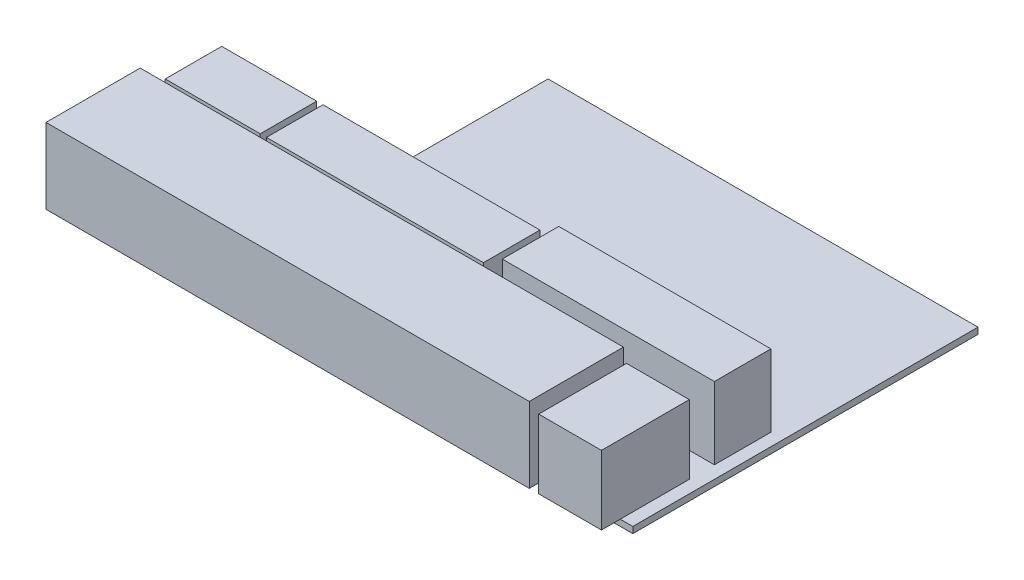
ISO-10303-21;
HEADER;
FILE_DESCRIPTION(('STEP AP214'),'2;1');
FILE_NAME('part.step','',(''),(''),'','','');
FILE_SCHEMA(('AUTOMOTIVE_DESIGN { 1 0 10303 214 1 1 1 1 }'));
ENDSEC;
DATA;
#1=APPLICATION_CONTEXT('core data for automotive mechanical design processes');
#2=APPLICATION_PROTOCOL_DEFINITION('international standard','automotive_design',2000,#1);
#3=PRODUCT_CONTEXT('',#1,'mechanical');
#4=PRODUCT('Part','Part','',(#3));
#5=PRODUCT_RELATED_PRODUCT_CATEGORY('part','',(#4));
#6=PRODUCT_DEFINITION_FORMATION('','',#4);
#7=PRODUCT_DEFINITION_CONTEXT('part definition',#1,'design');
#8=PRODUCT_DEFINITION('design','',#6,#7);
#9=PRODUCT_DEFINITION_SHAPE('','',#8);
#10=(LENGTH_UNIT() NAMED_UNIT(*) SI_UNIT(.MILLI.,.METRE.));
#11=(NAMED_UNIT(*) PLANE_ANGLE_UNIT() SI_UNIT($,.RADIAN.));
#12=(NAMED_UNIT(*) SI_UNIT($,.STERADIAN.) SOLID_ANGLE_UNIT());
#13=UNCERTAINTY_MEASURE_WITH_UNIT(LENGTH_MEASURE(1.E-05),#10,'distance_accuracy_value','');
#14=(GEOMETRIC_REPRESENTATION_CONTEXT(3) GLOBAL_UNCERTAINTY_ASSIGNED_CONTEXT((#13)) GLOBAL_UNIT_ASSIGNED_CONTEXT((#10,
#11,#12)) REPRESENTATION_CONTEXT('',''));
#15=CARTESIAN_POINT('',(0.,0.,0.));
#16=DIRECTION('',(0.,0.,1.));
#17=DIRECTION('',(1.,0.,0.));
#18=AXIS2_PLACEMENT_3D('',#15,#16,#17);
#19=CARTESIAN_POINT('',(10.7339639271346,12.5,3.62766252926461));
#20=DIRECTION('',(1.,0.,0.));
#21=DIRECTION('',(0.,0.,-1.));
#22=AXIS2_PLACEMENT_3D('',#19,#20,#21);
#23=PLANE('',#22);
#24=DIRECTION('',(0.,0.,1.));
#25=VECTOR('',#24,1.);
#26=CARTESIAN_POINT('',(10.7339639271346,1.,3.62766252926461));
#27=LINE('',#26,#25);
#28=CARTESIAN_POINT('',(10.7339639271346,1.,3.62766252926461));
#29=VERTEX_POINT('',#28);
#30=CARTESIAN_POINT('',(10.7339639271346,1.,12.6276625292646));
#31=VERTEX_POINT('',#30);
#32=EDGE_CURVE('E12',#29,#31,#27,.T.);
#33=ORIENTED_EDGE('',*,*,#32,.T.);
#34=DIRECTION('',(0.,-1.,0.));
#35=VECTOR('',#34,1.);
#36=CARTESIAN_POINT('',(10.7339639271346,12.5,12.6276625292646));
#37=LINE('',#36,#35);
#38=CARTESIAN_POINT('',(10.7339639271346,12.5,12.6276625292646));
#39=VERTEX_POINT('',#38);
#40=EDGE_CURVE('E127',#39,#31,#37,.T.);
#41=ORIENTED_EDGE('',*,*,#40,.F.);
#42=DIRECTION('',(0.,0.,1.));
#43=VECTOR('',#42,1.);
#44=CARTESIAN_POINT('',(10.7339639271346,12.5,3.62766252926461));
#45=LINE('',#44,#43);
#46=CARTESIAN_POINT('',(10.7339639271346,12.5,3.62766252926461));
#47=VERTEX_POINT('',#46);
#48=EDGE_CURVE('E60',#47,#39,#45,.T.);
#49=ORIENTED_EDGE('',*,*,#48,.F.);
#50=DIRECTION('',(0.,-1.,0.));
#51=VECTOR('',#50,1.);
#52=CARTESIAN_POINT('',(10.7339639271346,12.5,3.62766252926461));
#53=LINE('',#52,#51);
#54=EDGE_CURVE('E115',#47,#29,#53,.T.);
#55=ORIENTED_EDGE('',*,*,#54,.T.);
#56=EDGE_LOOP('',(#33,#41,#49,#55));
#57=FACE_BOUND('',#56,.T.);
#58=ADVANCED_FACE('F56',(#57),#23,.F.);
#59=CARTESIAN_POINT('',(10.7339639271346,12.5,12.6276625292646));
#60=DIRECTION('',(0.,0.,-1.));
#61=DIRECTION('',(-1.,0.,0.));
#62=AXIS2_PLACEMENT_3D('',#59,#60,#61);
#63=PLANE('',#62);
#64=DIRECTION('',(1.,0.,0.));
#65=VECTOR('',#64,1.);
#66=CARTESIAN_POINT('',(10.7339639271346,1.,12.6276625292646));
#67=LINE('',#66,#65);
#68=CARTESIAN_POINT('',(44.5329737002502,1.,12.6276625292646));
#69=VERTEX_POINT('',#68);
#70=EDGE_CURVE('E66',#31,#69,#67,.T.);
#71=ORIENTED_EDGE('',*,*,#70,.T.);
#72=DIRECTION('',(0.,-1.,0.));
#73=VECTOR('',#72,1.);
#74=CARTESIAN_POINT('',(44.5329737002502,12.5,12.6276625292646));
#75=LINE('',#74,#73);
#76=CARTESIAN_POINT('',(44.5329737002502,12.5,12.6276625292646));
#77=VERTEX_POINT('',#76);
#78=EDGE_CURVE('E111',#77,#69,#75,.T.);
#79=ORIENTED_EDGE('',*,*,#78,.F.);
#80=DIRECTION('',(1.,0.,0.));
#81=VECTOR('',#80,1.);
#82=CARTESIAN_POINT('',(10.7339639271346,12.5,12.6276625292646));
#83=LINE('',#82,#81);
#84=EDGE_CURVE('E90',#39,#77,#83,.T.);
#85=ORIENTED_EDGE('',*,*,#84,.F.);
#86=ORIENTED_EDGE('',*,*,#40,.T.);
#87=EDGE_LOOP('',(#71,#79,#85,#86));
#88=FACE_BOUND('',#87,.T.);
#89=ADVANCED_FACE('F130',(#88),#63,.F.);
#90=CARTESIAN_POINT('',(44.5329737002502,12.5,3.62766252926461));
#91=DIRECTION('',(-1.,0.,0.));
#92=DIRECTION('',(0.,0.,1.));
#93=AXIS2_PLACEMENT_3D('',#90,#91,#92);
#94=PLANE('',#93);
#95=DIRECTION('',(0.,0.,-1.));
#96=VECTOR('',#95,1.);
#97=CARTESIAN_POINT('',(44.5329737002502,1.,3.62766252926461));
#98=LINE('',#97,#96);
#99=CARTESIAN_POINT('',(44.5329737002502,1.,3.62766252926461));
#100=VERTEX_POINT('',#99);
#101=EDGE_CURVE('E106',#69,#100,#98,.T.);
#102=ORIENTED_EDGE('',*,*,#101,.T.);
#103=DIRECTION('',(0.,-1.,0.));
#104=VECTOR('',#103,1.);
#105=CARTESIAN_POINT('',(44.5329737002502,12.5,3.62766252926461));
#106=LINE('',#105,#104);
#107=CARTESIAN_POINT('',(44.5329737002502,12.5,3.62766252926461));
#108=VERTEX_POINT('',#107);
#109=EDGE_CURVE('E109',#108,#100,#106,.T.);
#110=ORIENTED_EDGE('',*,*,#109,.F.);
#111=DIRECTION('',(0.,0.,-1.));
#112=VECTOR('',#111,1.);
#113=CARTESIAN_POINT('',(44.5329737002502,12.5,3.62766252926461));
#114=LINE('',#113,#112);
#115=EDGE_CURVE('E123',#77,#108,#114,.T.);
#116=ORIENTED_EDGE('',*,*,#115,.F.);
#117=ORIENTED_EDGE('',*,*,#78,.T.);
#118=EDGE_LOOP('',(#102,#110,#116,#117));
#119=FACE_BOUND('',#118,.T.);
#120=ADVANCED_FACE('F107',(#119),#94,.F.);
#121=CARTESIAN_POINT('',(10.7339639271346,12.5,3.62766252926461));
#122=DIRECTION('',(0.,0.,1.));
#123=DIRECTION('',(1.,0.,0.));
#124=AXIS2_PLACEMENT_3D('',#121,#122,#123);
#125=PLANE('',#124);
#126=DIRECTION('',(-1.,0.,0.));
#127=VECTOR('',#126,1.);
#128=CARTESIAN_POINT('',(10.7339639271346,1.,3.62766252926461));
#129=LINE('',#128,#127);
#130=EDGE_CURVE('E100',#100,#29,#129,.T.);
#131=ORIENTED_EDGE('',*,*,#130,.T.);
#132=ORIENTED_EDGE('',*,*,#54,.F.);
#133=DIRECTION('',(-1.,0.,0.));
#134=VECTOR('',#133,1.);
#135=CARTESIAN_POINT('',(10.7339639271346,12.5,3.62766252926461));
#136=LINE('',#135,#134);
#137=EDGE_CURVE('E114',#108,#47,#136,.T.);
#138=ORIENTED_EDGE('',*,*,#137,.F.);
#139=ORIENTED_EDGE('',*,*,#109,.T.);
#140=EDGE_LOOP('',(#131,#132,#138,#139));
#141=FACE_BOUND('',#140,.T.);
#142=ADVANCED_FACE('F113',(#141),#125,.F.);
#143=CARTESIAN_POINT('',(0.,12.5,0.));
#144=DIRECTION('',(0.,1.,0.));
#145=DIRECTION('',(0.,0.,1.));
#146=AXIS2_PLACEMENT_3D('',#143,#144,#145);
#147=PLANE('',#146);
#148=ORIENTED_EDGE('',*,*,#48,.T.);
#149=ORIENTED_EDGE('',*,*,#84,.T.);
#150=ORIENTED_EDGE('',*,*,#115,.T.);
#151=ORIENTED_EDGE('',*,*,#137,.T.);
#152=EDGE_LOOP('',(#148,#149,#150,#151));
#153=FACE_BOUND('',#152,.T.);
#154=ADVANCED_FACE('F58',(#153),#147,.T.);
#155=CARTESIAN_POINT('',(0.,1.,0.));
#156=DIRECTION('',(0.,1.,0.));
#157=DIRECTION('',(0.,0.,1.));
#158=AXIS2_PLACEMENT_3D('',#155,#156,#157);
#159=PLANE('',#158);
#160=ORIENTED_EDGE('',*,*,#32,.F.);
#161=ORIENTED_EDGE('',*,*,#130,.F.);
#162=ORIENTED_EDGE('',*,*,#101,.F.);
#163=ORIENTED_EDGE('',*,*,#70,.F.);
#164=EDGE_LOOP('',(#160,#161,#162,#163));
#165=FACE_BOUND('',#164,.T.);
#166=ADVANCED_FACE('F117',(#165),#159,.F.);
#167=CLOSED_SHELL('',(#58,#89,#120,#142,#154,#166));
#168=MANIFOLD_SOLID_BREP('B2',#167);
#169=CARTESIAN_POINT('',(-24.8331179507798,12.5,5.62766252926461));
#170=DIRECTION('',(1.,0.,0.));
#171=DIRECTION('',(0.,0.,-1.));
#172=AXIS2_PLACEMENT_3D('',#169,#170,#171);
#173=PLANE('',#172);
#174=DIRECTION('',(0.,0.,1.));
#175=VECTOR('',#174,1.);
#176=CARTESIAN_POINT('',(-24.8331179507798,1.,5.62766252926461));
#177=LINE('',#176,#175);
#178=CARTESIAN_POINT('',(-24.8331179507798,1.,5.62766252926461));
#179=VERTEX_POINT('',#178);
#180=CARTESIAN_POINT('',(-24.8331179507798,1.,14.6276625292646));
#181=VERTEX_POINT('',#180);
#182=EDGE_CURVE('E54',#179,#181,#177,.T.);
#183=ORIENTED_EDGE('',*,*,#182,.T.);
#184=DIRECTION('',(0.,-1.,0.));
#185=VECTOR('',#184,1.);
#186=CARTESIAN_POINT('',(-24.8331179507798,12.5,14.6276625292646));
#187=LINE('',#186,#185);
#188=CARTESIAN_POINT('',(-24.8331179507798,12.5,14.6276625292646));
#189=VERTEX_POINT('',#188);
#190=EDGE_CURVE('E261',#189,#181,#187,.T.);
#191=ORIENTED_EDGE('',*,*,#190,.F.);
#192=DIRECTION('',(0.,0.,1.));
#193=VECTOR('',#192,1.);
#194=CARTESIAN_POINT('',(-24.8331179507798,12.5,5.62766252926461));
#195=LINE('',#194,#193);
#196=CARTESIAN_POINT('',(-24.8331179507798,12.5,5.62766252926461));
#197=VERTEX_POINT('',#196);
#198=EDGE_CURVE('E194',#197,#189,#195,.T.);
#199=ORIENTED_EDGE('',*,*,#198,.F.);
#200=DIRECTION('',(0.,-1.,0.));
#201=VECTOR('',#200,1.);
#202=CARTESIAN_POINT('',(-24.8331179507798,12.5,5.62766252926461));
#203=LINE('',#202,#201);
#204=EDGE_CURVE('E249',#197,#179,#203,.T.);
#205=ORIENTED_EDGE('',*,*,#204,.T.);
#206=EDGE_LOOP('',(#183,#191,#199,#205));
#207=FACE_BOUND('',#206,.T.);
#208=ADVANCED_FACE('F190',(#207),#173,.F.);
#209=CARTESIAN_POINT('',(-24.8331179507798,12.5,14.6276625292646));
#210=DIRECTION('',(0.,0.,-1.));
#211=DIRECTION('',(-1.,0.,0.));
#212=AXIS2_PLACEMENT_3D('',#209,#210,#211);
#213=PLANE('',#212);
#214=DIRECTION('',(1.,0.,0.));
#215=VECTOR('',#214,1.);
#216=CARTESIAN_POINT('',(-24.8331179507798,1.,14.6276625292646));
#217=LINE('',#216,#215);
#218=CARTESIAN_POINT('',(9.73396392713458,1.,14.6276625292646));
#219=VERTEX_POINT('',#218);
#220=EDGE_CURVE('E200',#181,#219,#217,.T.);
#221=ORIENTED_EDGE('',*,*,#220,.T.);
#222=DIRECTION('',(0.,-1.,0.));
#223=VECTOR('',#222,1.);
#224=CARTESIAN_POINT('',(9.73396392713458,12.5,14.6276625292646));
#225=LINE('',#224,#223);
#226=CARTESIAN_POINT('',(9.73396392713458,12.5,14.6276625292646));
#227=VERTEX_POINT('',#226);
#228=EDGE_CURVE('E245',#227,#219,#225,.T.);
#229=ORIENTED_EDGE('',*,*,#228,.F.);
#230=DIRECTION('',(1.,0.,0.));
#231=VECTOR('',#230,1.);
#232=CARTESIAN_POINT('',(-24.8331179507798,12.5,14.6276625292646));
#233=LINE('',#232,#231);
#234=EDGE_CURVE('E224',#189,#227,#233,.T.);
#235=ORIENTED_EDGE('',*,*,#234,.F.);
#236=ORIENTED_EDGE('',*,*,#190,.T.);
#237=EDGE_LOOP('',(#221,#229,#235,#236));
#238=FACE_BOUND('',#237,.T.);
#239=ADVANCED_FACE('F264',(#238),#213,.F.);
#240=CARTESIAN_POINT('',(9.73396392713458,12.5,14.6276625292646));
#241=DIRECTION('',(-1.,0.,0.));
#242=DIRECTION('',(0.,0.,1.));
#243=AXIS2_PLACEMENT_3D('',#240,#241,#242);
#244=PLANE('',#243);
#245=DIRECTION('',(0.,0.,-1.));
#246=VECTOR('',#245,1.);
#247=CARTESIAN_POINT('',(9.73396392713458,1.,14.6276625292646));
#248=LINE('',#247,#246);
#249=CARTESIAN_POINT('',(9.73396392713458,1.,5.62766252926461));
#250=VERTEX_POINT('',#249);
#251=EDGE_CURVE('E240',#219,#250,#248,.T.);
#252=ORIENTED_EDGE('',*,*,#251,.T.);
#253=DIRECTION('',(0.,-1.,0.));
#254=VECTOR('',#253,1.);
#255=CARTESIAN_POINT('',(9.73396392713458,12.5,5.62766252926461));
#256=LINE('',#255,#254);
#257=CARTESIAN_POINT('',(9.73396392713458,12.5,5.62766252926461));
#258=VERTEX_POINT('',#257);
#259=EDGE_CURVE('E243',#258,#250,#256,.T.);
#260=ORIENTED_EDGE('',*,*,#259,.F.);
#261=DIRECTION('',(0.,0.,-1.));
#262=VECTOR('',#261,1.);
#263=CARTESIAN_POINT('',(9.73396392713458,12.5,14.6276625292646));
#264=LINE('',#263,#262);
#265=EDGE_CURVE('E257',#227,#258,#264,.T.);
#266=ORIENTED_EDGE('',*,*,#265,.F.);
#267=ORIENTED_EDGE('',*,*,#228,.T.);
#268=EDGE_LOOP('',(#252,#260,#266,#267));
#269=FACE_BOUND('',#268,.T.);
#270=ADVANCED_FACE('F241',(#269),#244,.F.);
#271=CARTESIAN_POINT('',(9.73396392713458,12.5,5.62766252926461));
#272=DIRECTION('',(0.,0.,1.));
#273=DIRECTION('',(1.,0.,0.));
#274=AXIS2_PLACEMENT_3D('',#271,#272,#273);
#275=PLANE('',#274);
#276=DIRECTION('',(-1.,0.,0.));
#277=VECTOR('',#276,1.);
#278=CARTESIAN_POINT('',(9.73396392713458,1.,5.62766252926461));
#279=LINE('',#278,#277);
#280=EDGE_CURVE('E234',#250,#179,#279,.T.);
#281=ORIENTED_EDGE('',*,*,#280,.T.);
#282=ORIENTED_EDGE('',*,*,#204,.F.);
#283=DIRECTION('',(-1.,0.,0.));
#284=VECTOR('',#283,1.);
#285=CARTESIAN_POINT('',(9.73396392713458,12.5,5.62766252926461));
#286=LINE('',#285,#284);
#287=EDGE_CURVE('E248',#258,#197,#286,.T.);
#288=ORIENTED_EDGE('',*,*,#287,.F.);
#289=ORIENTED_EDGE('',*,*,#259,.T.);
#290=EDGE_LOOP('',(#281,#282,#288,#289));
#291=FACE_BOUND('',#290,.T.);
#292=ADVANCED_FACE('F247',(#291),#275,.F.);
#293=CARTESIAN_POINT('',(0.,12.5,0.));
#294=DIRECTION('',(0.,1.,0.));
#295=DIRECTION('',(0.,0.,1.));
#296=AXIS2_PLACEMENT_3D('',#293,#294,#295);
#297=PLANE('',#296);
#298=ORIENTED_EDGE('',*,*,#198,.T.);
#299=ORIENTED_EDGE('',*,*,#234,.T.);
#300=ORIENTED_EDGE('',*,*,#265,.T.);
#301=ORIENTED_EDGE('',*,*,#287,.T.);
#302=EDGE_LOOP('',(#298,#299,#300,#301));
#303=FACE_BOUND('',#302,.T.);
#304=ADVANCED_FACE('F192',(#303),#297,.T.);
#305=CARTESIAN_POINT('',(0.,1.,0.));
#306=DIRECTION('',(0.,1.,0.));
#307=DIRECTION('',(0.,0.,1.));
#308=AXIS2_PLACEMENT_3D('',#305,#306,#307);
#309=PLANE('',#308);
#310=ORIENTED_EDGE('',*,*,#182,.F.);
#311=ORIENTED_EDGE('',*,*,#280,.F.);
#312=ORIENTED_EDGE('',*,*,#251,.F.);
#313=ORIENTED_EDGE('',*,*,#220,.F.);
#314=EDGE_LOOP('',(#310,#311,#312,#313));
#315=FACE_BOUND('',#314,.T.);
#316=ADVANCED_FACE('F251',(#315),#309,.F.);
#317=CLOSED_SHELL('',(#208,#239,#270,#292,#304,#316));
#318=MANIFOLD_SOLID_BREP('B6',#317);
#319=CARTESIAN_POINT('',(-25.8331179507798,12.5,14.6276625292646));
#320=DIRECTION('',(0.,0.,-1.));
#321=DIRECTION('',(-1.,0.,0.));
#322=AXIS2_PLACEMENT_3D('',#319,#320,#321);
#323=PLANE('',#322);
#324=DIRECTION('',(1.,0.,0.));
#325=VECTOR('',#324,1.);
#326=CARTESIAN_POINT('',(-25.8331179507798,1.,14.6276625292646));
#327=LINE('',#326,#325);
#328=CARTESIAN_POINT('',(-40.9670262997498,1.,14.6276625292646));
#329=VERTEX_POINT('',#328);
#330=CARTESIAN_POINT('',(-25.8331179507798,1.,14.6276625292646));
#331=VERTEX_POINT('',#330);
#332=EDGE_CURVE('E386',#329,#331,#327,.T.);
#333=ORIENTED_EDGE('',*,*,#332,.T.);
#334=DIRECTION('',(0.,-1.,0.));
#335=VECTOR('',#334,1.);
#336=CARTESIAN_POINT('',(-25.8331179507798,12.5,14.6276625292646));
#337=LINE('',#336,#335);
#338=CARTESIAN_POINT('',(-25.8331179507798,12.5,14.6276625292646));
#339=VERTEX_POINT('',#338);
#340=EDGE_CURVE('E188',#339,#331,#337,.T.);
#341=ORIENTED_EDGE('',*,*,#340,.F.);
#342=DIRECTION('',(1.,0.,0.));
#343=VECTOR('',#342,1.);
#344=CARTESIAN_POINT('',(-25.8331179507798,12.5,14.6276625292646));
#345=LINE('',#344,#343);
#346=CARTESIAN_POINT('',(-40.9670262997498,12.5,14.6276625292646));
#347=VERTEX_POINT('',#346);
#348=EDGE_CURVE('E374',#347,#339,#345,.T.);
#349=ORIENTED_EDGE('',*,*,#348,.F.);
#350=DIRECTION('',(0.,-1.,0.));
#351=VECTOR('',#350,1.);
#352=CARTESIAN_POINT('',(-40.9670262997498,12.5,14.6276625292646));
#353=LINE('',#352,#351);
#354=EDGE_CURVE('E382',#347,#329,#353,.T.);
#355=ORIENTED_EDGE('',*,*,#354,.T.);
#356=EDGE_LOOP('',(#333,#341,#349,#355));
#357=FACE_BOUND('',#356,.T.);
#358=ADVANCED_FACE('F323',(#357),#323,.F.);
#359=CARTESIAN_POINT('',(-25.8331179507798,12.5,5.62766252926461));
#360=DIRECTION('',(-1.,0.,0.));
#361=DIRECTION('',(0.,0.,1.));
#362=AXIS2_PLACEMENT_3D('',#359,#360,#361);
#363=PLANE('',#362);
#364=DIRECTION('',(0.,0.,-1.));
#365=VECTOR('',#364,1.);
#366=CARTESIAN_POINT('',(-25.8331179507798,1.,5.62766252926461));
#367=LINE('',#366,#365);
#368=CARTESIAN_POINT('',(-25.8331179507798,1.,5.62766252926461));
#369=VERTEX_POINT('',#368);
#370=EDGE_CURVE('E378',#331,#369,#367,.T.);
#371=ORIENTED_EDGE('',*,*,#370,.T.);
#372=DIRECTION('',(0.,-1.,0.));
#373=VECTOR('',#372,1.);
#374=CARTESIAN_POINT('',(-25.8331179507798,12.5,5.62766252926461));
#375=LINE('',#374,#373);
#376=CARTESIAN_POINT('',(-25.8331179507798,12.5,5.62766252926461));
#377=VERTEX_POINT('',#376);
#378=EDGE_CURVE('E331',#377,#369,#375,.T.);
#379=ORIENTED_EDGE('',*,*,#378,.F.);
#380=DIRECTION('',(0.,0.,-1.));
#381=VECTOR('',#380,1.);
#382=CARTESIAN_POINT('',(-25.8331179507798,12.5,5.62766252926461));
#383=LINE('',#382,#381);
#384=EDGE_CURVE('E369',#339,#377,#383,.T.);
#385=ORIENTED_EDGE('',*,*,#384,.F.);
#386=ORIENTED_EDGE('',*,*,#340,.T.);
#387=EDGE_LOOP('',(#371,#379,#385,#386));
#388=FACE_BOUND('',#387,.T.);
#389=ADVANCED_FACE('F377',(#388),#363,.F.);
#390=CARTESIAN_POINT('',(-40.9670262997498,12.5,5.62766252926461));
#391=DIRECTION('',(0.,0.,1.));
#392=DIRECTION('',(1.,0.,0.));
#393=AXIS2_PLACEMENT_3D('',#390,#391,#392);
#394=PLANE('',#393);
#395=DIRECTION('',(-1.,0.,0.));
#396=VECTOR('',#395,1.);
#397=CARTESIAN_POINT('',(-40.9670262997498,1.,5.62766252926461));
#398=LINE('',#397,#396);
#399=CARTESIAN_POINT('',(-40.9670262997498,1.,5.62766252926461));
#400=VERTEX_POINT('',#399);
#401=EDGE_CURVE('E356',#369,#400,#398,.T.);
#402=ORIENTED_EDGE('',*,*,#401,.T.);
#403=DIRECTION('',(0.,-1.,0.));
#404=VECTOR('',#403,1.);
#405=CARTESIAN_POINT('',(-40.9670262997498,12.5,5.62766252926461));
#406=LINE('',#405,#404);
#407=CARTESIAN_POINT('',(-40.9670262997498,12.5,5.62766252926461));
#408=VERTEX_POINT('',#407);
#409=EDGE_CURVE('E379',#408,#400,#406,.T.);
#410=ORIENTED_EDGE('',*,*,#409,.F.);
#411=DIRECTION('',(-1.,0.,0.));
#412=VECTOR('',#411,1.);
#413=CARTESIAN_POINT('',(-40.9670262997498,12.5,5.62766252926461));
#414=LINE('',#413,#412);
#415=EDGE_CURVE('E372',#377,#408,#414,.T.);
#416=ORIENTED_EDGE('',*,*,#415,.F.);
#417=ORIENTED_EDGE('',*,*,#378,.T.);
#418=EDGE_LOOP('',(#402,#410,#416,#417));
#419=FACE_BOUND('',#418,.T.);
#420=ADVANCED_FACE('F380',(#419),#394,.F.);
#421=CARTESIAN_POINT('',(-40.9670262997498,12.5,14.6276625292646));
#422=DIRECTION('',(1.,0.,0.));
#423=DIRECTION('',(0.,0.,-1.));
#424=AXIS2_PLACEMENT_3D('',#421,#422,#423);
#425=PLANE('',#424);
#426=DIRECTION('',(0.,0.,1.));
#427=VECTOR('',#426,1.);
#428=CARTESIAN_POINT('',(-40.9670262997498,1.,14.6276625292646));
#429=LINE('',#428,#427);
#430=EDGE_CURVE('E362',#400,#329,#429,.T.);
#431=ORIENTED_EDGE('',*,*,#430,.T.);
#432=ORIENTED_EDGE('',*,*,#354,.F.);
#433=DIRECTION('',(0.,0.,1.));
#434=VECTOR('',#433,1.);
#435=CARTESIAN_POINT('',(-40.9670262997498,12.5,14.6276625292646));
#436=LINE('',#435,#434);
#437=EDGE_CURVE('E339',#408,#347,#436,.T.);
#438=ORIENTED_EDGE('',*,*,#437,.F.);
#439=ORIENTED_EDGE('',*,*,#409,.T.);
#440=EDGE_LOOP('',(#431,#432,#438,#439));
#441=FACE_BOUND('',#440,.T.);
#442=ADVANCED_FACE('F393',(#441),#425,.F.);
#443=CARTESIAN_POINT('',(0.,12.5,0.));
#444=DIRECTION('',(0.,-1.,0.));
#445=DIRECTION('',(0.,0.,-1.));
#446=AXIS2_PLACEMENT_3D('',#443,#444,#445);
#447=PLANE('',#446);
#448=ORIENTED_EDGE('',*,*,#348,.T.);
#449=ORIENTED_EDGE('',*,*,#384,.T.);
#450=ORIENTED_EDGE('',*,*,#415,.T.);
#451=ORIENTED_EDGE('',*,*,#437,.T.);
#452=EDGE_LOOP('',(#448,#449,#450,#451));
#453=FACE_BOUND('',#452,.T.);
#454=ADVANCED_FACE('F370',(#453),#447,.F.);
#455=CARTESIAN_POINT('',(0.,1.,0.));
#456=DIRECTION('',(0.,-1.,0.));
#457=DIRECTION('',(0.,0.,-1.));
#458=AXIS2_PLACEMENT_3D('',#455,#456,#457);
#459=PLANE('',#458);
#460=ORIENTED_EDGE('',*,*,#332,.F.);
#461=ORIENTED_EDGE('',*,*,#430,.F.);
#462=ORIENTED_EDGE('',*,*,#401,.F.);
#463=ORIENTED_EDGE('',*,*,#370,.F.);
#464=EDGE_LOOP('',(#460,#461,#462,#463));
#465=FACE_BOUND('',#464,.T.);
#466=ADVANCED_FACE('F396',(#465),#459,.T.);
#467=CLOSED_SHELL('',(#358,#389,#420,#442,#454,#466));
#468=MANIFOLD_SOLID_BREP('B48',#467);
#469=CARTESIAN_POINT('',(0.,1.,0.));
#470=DIRECTION('',(0.,-1.,0.));
#471=DIRECTION('',(0.,0.,-1.));
#472=AXIS2_PLACEMENT_3D('',#469,#470,#471);
#473=PLANE('',#472);
#474=DIRECTION('',(0.,0.,1.));
#475=VECTOR('',#474,1.);
#476=CARTESIAN_POINT('',(34.5329737002502,1.,16.6276625292646));
#477=LINE('',#476,#475);
#478=CARTESIAN_POINT('',(34.5329737002502,1.,16.6276625292646));
#479=VERTEX_POINT('',#478);
#480=CARTESIAN_POINT('',(34.5329737002502,1.,27.6276625292646));
#481=VERTEX_POINT('',#480);
#482=EDGE_CURVE('E465',#479,#481,#477,.T.);
#483=ORIENTED_EDGE('',*,*,#482,.F.);
#484=DIRECTION('',(-1.,0.,0.));
#485=VECTOR('',#484,1.);
#486=CARTESIAN_POINT('',(34.5329737002502,1.,16.6276625292646));
#487=LINE('',#486,#485);
#488=CARTESIAN_POINT('',(44.5329737002502,1.,16.6276625292646));
#489=VERTEX_POINT('',#488);
#490=EDGE_CURVE('E469',#489,#479,#487,.T.);
#491=ORIENTED_EDGE('',*,*,#490,.F.);
#492=DIRECTION('',(0.,0.,-1.));
#493=VECTOR('',#492,1.);
#494=CARTESIAN_POINT('',(44.5329737002502,1.,16.6276625292646));
#495=LINE('',#494,#493);
#496=CARTESIAN_POINT('',(44.5329737002502,1.,27.6276625292646));
#497=VERTEX_POINT('',#496);
#498=EDGE_CURVE('E898',#497,#489,#495,.T.);
#499=ORIENTED_EDGE('',*,*,#498,.F.);
#500=DIRECTION('',(1.,0.,0.));
#501=VECTOR('',#500,1.);
#502=CARTESIAN_POINT('',(-46.9670262997498,1.,27.6276625292646));
#503=LINE('',#502,#501);
#504=CARTESIAN_POINT('',(46.5329737002502,1.,27.6276625292646));
#505=VERTEX_POINT('',#504);
#506=EDGE_CURVE('E654',#497,#505,#503,.T.);
#507=ORIENTED_EDGE('',*,*,#506,.T.);
#508=DIRECTION('',(0.,0.,1.));
#509=VECTOR('',#508,1.);
#510=CARTESIAN_POINT('',(46.5329737002502,1.,-27.3723374707354));
#511=LINE('',#510,#509);
#512=CARTESIAN_POINT('',(46.5329737002502,1.,-27.3723374707354));
#513=VERTEX_POINT('',#512);
#514=EDGE_CURVE('E650',#513,#505,#511,.T.);
#515=ORIENTED_EDGE('',*,*,#514,.F.);
#516=DIRECTION('',(1.,0.,0.));
#517=VECTOR('',#516,1.);
#518=CARTESIAN_POINT('',(-21.9670262997498,1.,-27.3723374707354));
#519=LINE('',#518,#517);
#520=CARTESIAN_POINT('',(-21.9670262997498,1.,-27.3723374707354));
#521=VERTEX_POINT('',#520);
#522=EDGE_CURVE('E645',#521,#513,#519,.T.);
#523=ORIENTED_EDGE('',*,*,#522,.F.);
#524=DIRECTION('',(0.,0.,-1.));
#525=VECTOR('',#524,1.);
#526=CARTESIAN_POINT('',(-21.9670262997498,1.,0.627662529264608));
#527=LINE('',#526,#525);
#528=CARTESIAN_POINT('',(-21.9670262997498,1.,0.627662529264608));
#529=VERTEX_POINT('',#528);
#530=EDGE_CURVE('E641',#529,#521,#527,.T.);
#531=ORIENTED_EDGE('',*,*,#530,.F.);
#532=DIRECTION('',(1.,0.,0.));
#533=VECTOR('',#532,1.);
#534=CARTESIAN_POINT('',(-46.9670262997498,1.,0.627662529264608));
#535=LINE('',#534,#533);
#536=CARTESIAN_POINT('',(-46.9670262997498,1.,0.627662529264608));
#537=VERTEX_POINT('',#536);
#538=EDGE_CURVE('E663',#537,#529,#535,.T.);
#539=ORIENTED_EDGE('',*,*,#538,.F.);
#540=DIRECTION('',(0.,0.,1.));
#541=VECTOR('',#540,1.);
#542=CARTESIAN_POINT('',(-46.9670262997498,1.,0.627662529264608));
#543=LINE('',#542,#541);
#544=CARTESIAN_POINT('',(-46.9670262997498,1.,27.6276625292646));
#545=VERTEX_POINT('',#544);
#546=EDGE_CURVE('E659',#537,#545,#543,.T.);
#547=ORIENTED_EDGE('',*,*,#546,.T.);
#548=CARTESIAN_POINT('',(-43.9670262997498,1.,27.6276625292646));
#549=VERTEX_POINT('',#548);
#550=EDGE_CURVE('E655',#545,#549,#503,.T.);
#551=ORIENTED_EDGE('',*,*,#550,.T.);
#552=DIRECTION('',(0.,0.,1.));
#553=VECTOR('',#552,1.);
#554=CARTESIAN_POINT('',(-43.9670262997498,1.,15.6276625292646));
#555=LINE('',#554,#553);
#556=CARTESIAN_POINT('',(-43.9670262997498,1.,15.6276625292646));
#557=VERTEX_POINT('',#556);
#558=EDGE_CURVE('E594',#557,#549,#555,.T.);
#559=ORIENTED_EDGE('',*,*,#558,.F.);
#560=DIRECTION('',(-1.,0.,0.));
#561=VECTOR('',#560,1.);
#562=CARTESIAN_POINT('',(-43.9670262997498,1.,15.6276625292646));
#563=LINE('',#562,#561);
#564=CARTESIAN_POINT('',(33.0329737002502,1.,15.6276625292646));
#565=VERTEX_POINT('',#564);
#566=EDGE_CURVE('E605',#565,#557,#563,.T.);
#567=ORIENTED_EDGE('',*,*,#566,.F.);
#568=DIRECTION('',(0.,0.,-1.));
#569=VECTOR('',#568,1.);
#570=CARTESIAN_POINT('',(33.0329737002502,1.,15.6276625292646));
#571=LINE('',#570,#569);
#572=CARTESIAN_POINT('',(33.0329737002502,1.,27.6276625292646));
#573=VERTEX_POINT('',#572);
#574=EDGE_CURVE('E321',#573,#565,#571,.T.);
#575=ORIENTED_EDGE('',*,*,#574,.F.);
#576=EDGE_CURVE('E911',#573,#481,#503,.T.);
#577=ORIENTED_EDGE('',*,*,#576,.T.);
#578=EDGE_LOOP('',(#483,#491,#499,#507,#515,#523,#531,#539,#547,#551,#559,#567,#575,#577));
#579=FACE_BOUND('',#578,.T.);
#580=ADVANCED_FACE('F446',(#579),#473,.F.);
#581=CARTESIAN_POINT('',(-21.9670262997498,1.,0.627662529264608));
#582=DIRECTION('',(-1.,0.,0.));
#583=DIRECTION('',(0.,0.,1.));
#584=AXIS2_PLACEMENT_3D('',#581,#582,#583);
#585=PLANE('',#584);
#586=DIRECTION('',(0.,0.,-1.));
#587=VECTOR('',#586,1.);
#588=CARTESIAN_POINT('',(-21.9670262997498,0.,0.627662529264608));
#589=LINE('',#588,#587);
#590=CARTESIAN_POINT('',(-21.9670262997498,0.,0.627662529264608));
#591=VERTEX_POINT('',#590);
#592=CARTESIAN_POINT('',(-21.9670262997498,0.,-27.3723374707354));
#593=VERTEX_POINT('',#592);
#594=EDGE_CURVE('E640',#591,#593,#589,.T.);
#595=ORIENTED_EDGE('',*,*,#594,.F.);
#596=DIRECTION('',(0.,-1.,0.));
#597=VECTOR('',#596,1.);
#598=CARTESIAN_POINT('',(-21.9670262997498,1.,0.627662529264608));
#599=LINE('',#598,#597);
#600=EDGE_CURVE('E456',#529,#591,#599,.T.);
#601=ORIENTED_EDGE('',*,*,#600,.F.);
#602=ORIENTED_EDGE('',*,*,#530,.T.);
#603=DIRECTION('',(0.,-1.,0.));
#604=VECTOR('',#603,1.);
#605=CARTESIAN_POINT('',(-21.9670262997498,1.,-27.3723374707354));
#606=LINE('',#605,#604);
#607=EDGE_CURVE('E450',#521,#593,#606,.T.);
#608=ORIENTED_EDGE('',*,*,#607,.T.);
#609=EDGE_LOOP('',(#595,#601,#602,#608));
#610=FACE_BOUND('',#609,.T.);
#611=ADVANCED_FACE('F448',(#610),#585,.T.);
#612=CARTESIAN_POINT('',(-46.9670262997498,1.,0.627662529264608));
#613=DIRECTION('',(0.,0.,-1.));
#614=DIRECTION('',(-1.,0.,0.));
#615=AXIS2_PLACEMENT_3D('',#612,#613,#614);
#616=PLANE('',#615);
#617=DIRECTION('',(1.,0.,0.));
#618=VECTOR('',#617,1.);
#619=CARTESIAN_POINT('',(-46.9670262997498,0.,0.627662529264608));
#620=LINE('',#619,#618);
#621=CARTESIAN_POINT('',(-46.9670262997498,0.,0.627662529264608));
#622=VERTEX_POINT('',#621);
#623=EDGE_CURVE('E646',#622,#591,#620,.T.);
#624=ORIENTED_EDGE('',*,*,#623,.F.);
#625=DIRECTION('',(0.,-1.,0.));
#626=VECTOR('',#625,1.);
#627=CARTESIAN_POINT('',(-46.9670262997498,1.,0.627662529264608));
#628=LINE('',#627,#626);
#629=EDGE_CURVE('E690',#537,#622,#628,.T.);
#630=ORIENTED_EDGE('',*,*,#629,.F.);
#631=ORIENTED_EDGE('',*,*,#538,.T.);
#632=ORIENTED_EDGE('',*,*,#600,.T.);
#633=EDGE_LOOP('',(#624,#630,#631,#632));
#634=FACE_BOUND('',#633,.T.);
#635=ADVANCED_FACE('F716',(#634),#616,.T.);
#636=CARTESIAN_POINT('',(-46.9670262997498,1.,0.627662529264608));
#637=DIRECTION('',(1.,0.,0.));
#638=DIRECTION('',(0.,0.,-1.));
#639=AXIS2_PLACEMENT_3D('',#636,#637,#638);
#640=PLANE('',#639);
#641=DIRECTION('',(0.,0.,1.));
#642=VECTOR('',#641,1.);
#643=CARTESIAN_POINT('',(-46.9670262997498,0.,0.627662529264608));
#644=LINE('',#643,#642);
#645=CARTESIAN_POINT('',(-46.9670262997498,0.,27.6276625292646));
#646=VERTEX_POINT('',#645);
#647=EDGE_CURVE('E682',#622,#646,#644,.T.);
#648=ORIENTED_EDGE('',*,*,#647,.T.);
#649=DIRECTION('',(0.,-1.,0.));
#650=VECTOR('',#649,1.);
#651=CARTESIAN_POINT('',(-46.9670262997498,1.,27.6276625292646));
#652=LINE('',#651,#650);
#653=EDGE_CURVE('E693',#545,#646,#652,.T.);
#654=ORIENTED_EDGE('',*,*,#653,.F.);
#655=ORIENTED_EDGE('',*,*,#546,.F.);
#656=ORIENTED_EDGE('',*,*,#629,.T.);
#657=EDGE_LOOP('',(#648,#654,#655,#656));
#658=FACE_BOUND('',#657,.T.);
#659=ADVANCED_FACE('F728',(#658),#640,.F.);
#660=CARTESIAN_POINT('',(-46.9670262997498,1.,27.6276625292646));
#661=DIRECTION('',(0.,0.,-1.));
#662=DIRECTION('',(-1.,0.,0.));
#663=AXIS2_PLACEMENT_3D('',#660,#661,#662);
#664=PLANE('',#663);
#665=DIRECTION('',(1.,0.,0.));
#666=VECTOR('',#665,1.);
#667=CARTESIAN_POINT('',(-46.9670262997498,0.,27.6276625292646));
#668=LINE('',#667,#666);
#669=CARTESIAN_POINT('',(46.5329737002502,0.,27.6276625292646));
#670=VERTEX_POINT('',#669);
#671=EDGE_CURVE('E678',#646,#670,#668,.T.);
#672=ORIENTED_EDGE('',*,*,#671,.T.);
#673=DIRECTION('',(0.,-1.,0.));
#674=VECTOR('',#673,1.);
#675=CARTESIAN_POINT('',(46.5329737002502,1.,27.6276625292646));
#676=LINE('',#675,#674);
#677=EDGE_CURVE('E697',#505,#670,#676,.T.);
#678=ORIENTED_EDGE('',*,*,#677,.F.);
#679=ORIENTED_EDGE('',*,*,#506,.F.);
#680=EDGE_CURVE('E909',#481,#497,#503,.T.);
#681=ORIENTED_EDGE('',*,*,#680,.F.);
#682=ORIENTED_EDGE('',*,*,#576,.F.);
#683=EDGE_CURVE('E660',#549,#573,#503,.T.);
#684=ORIENTED_EDGE('',*,*,#683,.F.);
#685=ORIENTED_EDGE('',*,*,#550,.F.);
#686=ORIENTED_EDGE('',*,*,#653,.T.);
#687=EDGE_LOOP('',(#672,#678,#679,#681,#682,#684,#685,#686));
#688=FACE_BOUND('',#687,.T.);
#689=ADVANCED_FACE('F724',(#688),#664,.F.);
#690=CARTESIAN_POINT('',(46.5329737002502,1.,-27.3723374707354));
#691=DIRECTION('',(1.,0.,0.));
#692=DIRECTION('',(0.,0.,-1.));
#693=AXIS2_PLACEMENT_3D('',#690,#691,#692);
#694=PLANE('',#693);
#695=DIRECTION('',(0.,0.,1.));
#696=VECTOR('',#695,1.);
#697=CARTESIAN_POINT('',(46.5329737002502,0.,-27.3723374707354));
#698=LINE('',#697,#696);
#699=CARTESIAN_POINT('',(46.5329737002502,0.,-27.3723374707354));
#700=VERTEX_POINT('',#699);
#701=EDGE_CURVE('E674',#700,#670,#698,.T.);
#702=ORIENTED_EDGE('',*,*,#701,.F.);
#703=DIRECTION('',(0.,-1.,0.));
#704=VECTOR('',#703,1.);
#705=CARTESIAN_POINT('',(46.5329737002502,1.,-27.3723374707354));
#706=LINE('',#705,#704);
#707=EDGE_CURVE('E699',#513,#700,#706,.T.);
#708=ORIENTED_EDGE('',*,*,#707,.F.);
#709=ORIENTED_EDGE('',*,*,#514,.T.);
#710=ORIENTED_EDGE('',*,*,#677,.T.);
#711=EDGE_LOOP('',(#702,#708,#709,#710));
#712=FACE_BOUND('',#711,.T.);
#713=ADVANCED_FACE('F722',(#712),#694,.T.);
#714=CARTESIAN_POINT('',(-21.9670262997498,1.,-27.3723374707354));
#715=DIRECTION('',(0.,0.,-1.));
#716=DIRECTION('',(-1.,0.,0.));
#717=AXIS2_PLACEMENT_3D('',#714,#715,#716);
#718=PLANE('',#717);
#719=DIRECTION('',(1.,0.,0.));
#720=VECTOR('',#719,1.);
#721=CARTESIAN_POINT('',(-21.9670262997498,0.,-27.3723374707354));
#722=LINE('',#721,#720);
#723=EDGE_CURVE('E670',#593,#700,#722,.T.);
#724=ORIENTED_EDGE('',*,*,#723,.F.);
#725=ORIENTED_EDGE('',*,*,#607,.F.);
#726=ORIENTED_EDGE('',*,*,#522,.T.);
#727=ORIENTED_EDGE('',*,*,#707,.T.);
#728=EDGE_LOOP('',(#724,#725,#726,#727));
#729=FACE_BOUND('',#728,.T.);
#730=ADVANCED_FACE('F709',(#729),#718,.T.);
#731=CARTESIAN_POINT('',(0.,0.,0.));
#732=DIRECTION('',(0.,-1.,0.));
#733=DIRECTION('',(0.,0.,-1.));
#734=AXIS2_PLACEMENT_3D('',#731,#732,#733);
#735=PLANE('',#734);
#736=ORIENTED_EDGE('',*,*,#594,.T.);
#737=ORIENTED_EDGE('',*,*,#723,.T.);
#738=ORIENTED_EDGE('',*,*,#701,.T.);
#739=ORIENTED_EDGE('',*,*,#671,.F.);
#740=ORIENTED_EDGE('',*,*,#647,.F.);
#741=ORIENTED_EDGE('',*,*,#623,.T.);
#742=EDGE_LOOP('',(#736,#737,#738,#739,#740,#741));
#743=FACE_BOUND('',#742,.T.);
#744=ADVANCED_FACE('F711',(#743),#735,.T.);
#745=CARTESIAN_POINT('',(0.,1.,0.));
#746=DIRECTION('',(0.,1.,0.));
#747=DIRECTION('',(0.,0.,1.));
#748=AXIS2_PLACEMENT_3D('',#745,#746,#747);
#749=PLANE('',#748);
#750=CARTESIAN_POINT('',(-43.9670262997498,1.,30.6276625292646));
#751=VERTEX_POINT('',#750);
#752=EDGE_CURVE('E590',#549,#751,#555,.T.);
#753=ORIENTED_EDGE('',*,*,#752,.F.);
#754=ORIENTED_EDGE('',*,*,#683,.T.);
#755=CARTESIAN_POINT('',(33.0329737002502,1.,30.6276625292646));
#756=VERTEX_POINT('',#755);
#757=EDGE_CURVE('E458',#756,#573,#571,.T.);
#758=ORIENTED_EDGE('',*,*,#757,.F.);
#759=DIRECTION('',(1.,0.,0.));
#760=VECTOR('',#759,1.);
#761=CARTESIAN_POINT('',(-43.9670262997498,1.,30.6276625292646));
#762=LINE('',#761,#760);
#763=EDGE_CURVE('E617',#751,#756,#762,.T.);
#764=ORIENTED_EDGE('',*,*,#763,.F.);
#765=EDGE_LOOP('',(#753,#754,#758,#764));
#766=FACE_BOUND('',#765,.T.);
#767=ADVANCED_FACE('F733',(#766),#749,.F.);
#768=CARTESIAN_POINT('',(-43.9670262997498,13.,15.6276625292646));
#769=DIRECTION('',(1.,0.,0.));
#770=DIRECTION('',(0.,0.,-1.));
#771=AXIS2_PLACEMENT_3D('',#768,#769,#770);
#772=PLANE('',#771);
#773=ORIENTED_EDGE('',*,*,#558,.T.);
#774=ORIENTED_EDGE('',*,*,#752,.T.);
#775=DIRECTION('',(0.,-1.,0.));
#776=VECTOR('',#775,1.);
#777=CARTESIAN_POINT('',(-43.9670262997498,13.,30.6276625292646));
#778=LINE('',#777,#776);
#779=CARTESIAN_POINT('',(-43.9670262997498,13.,30.6276625292646));
#780=VERTEX_POINT('',#779);
#781=EDGE_CURVE('E636',#780,#751,#778,.T.);
#782=ORIENTED_EDGE('',*,*,#781,.F.);
#783=DIRECTION('',(0.,0.,1.));
#784=VECTOR('',#783,1.);
#785=CARTESIAN_POINT('',(-43.9670262997498,13.,15.6276625292646));
#786=LINE('',#785,#784);
#787=CARTESIAN_POINT('',(-43.9670262997498,13.,15.6276625292646));
#788=VERTEX_POINT('',#787);
#789=EDGE_CURVE('E600',#788,#780,#786,.T.);
#790=ORIENTED_EDGE('',*,*,#789,.F.);
#791=DIRECTION('',(0.,-1.,0.));
#792=VECTOR('',#791,1.);
#793=CARTESIAN_POINT('',(-43.9670262997498,13.,15.6276625292646));
#794=LINE('',#793,#792);
#795=EDGE_CURVE('E613',#788,#557,#794,.T.);
#796=ORIENTED_EDGE('',*,*,#795,.T.);
#797=EDGE_LOOP('',(#773,#774,#782,#790,#796));
#798=FACE_BOUND('',#797,.T.);
#799=ADVANCED_FACE('F737',(#798),#772,.F.);
#800=CARTESIAN_POINT('',(-43.9670262997498,13.,30.6276625292646));
#801=DIRECTION('',(0.,0.,-1.));
#802=DIRECTION('',(-1.,0.,0.));
#803=AXIS2_PLACEMENT_3D('',#800,#801,#802);
#804=PLANE('',#803);
#805=ORIENTED_EDGE('',*,*,#763,.T.);
#806=DIRECTION('',(0.,-1.,0.));
#807=VECTOR('',#806,1.);
#808=CARTESIAN_POINT('',(33.0329737002502,13.,30.6276625292646));
#809=LINE('',#808,#807);
#810=CARTESIAN_POINT('',(33.0329737002502,13.,30.6276625292646));
#811=VERTEX_POINT('',#810);
#812=EDGE_CURVE('E632',#811,#756,#809,.T.);
#813=ORIENTED_EDGE('',*,*,#812,.F.);
#814=DIRECTION('',(1.,0.,0.));
#815=VECTOR('',#814,1.);
#816=CARTESIAN_POINT('',(-43.9670262997498,13.,30.6276625292646));
#817=LINE('',#816,#815);
#818=EDGE_CURVE('E604',#780,#811,#817,.T.);
#819=ORIENTED_EDGE('',*,*,#818,.F.);
#820=ORIENTED_EDGE('',*,*,#781,.T.);
#821=EDGE_LOOP('',(#805,#813,#819,#820));
#822=FACE_BOUND('',#821,.T.);
#823=ADVANCED_FACE('F750',(#822),#804,.F.);
#824=CARTESIAN_POINT('',(33.0329737002502,13.,15.6276625292646));
#825=DIRECTION('',(-1.,0.,0.));
#826=DIRECTION('',(0.,0.,1.));
#827=AXIS2_PLACEMENT_3D('',#824,#825,#826);
#828=PLANE('',#827);
#829=ORIENTED_EDGE('',*,*,#757,.T.);
#830=ORIENTED_EDGE('',*,*,#574,.T.);
#831=DIRECTION('',(0.,-1.,0.));
#832=VECTOR('',#831,1.);
#833=CARTESIAN_POINT('',(33.0329737002502,13.,15.6276625292646));
#834=LINE('',#833,#832);
#835=CARTESIAN_POINT('',(33.0329737002502,13.,15.6276625292646));
#836=VERTEX_POINT('',#835);
#837=EDGE_CURVE('E628',#836,#565,#834,.T.);
#838=ORIENTED_EDGE('',*,*,#837,.F.);
#839=DIRECTION('',(0.,0.,-1.));
#840=VECTOR('',#839,1.);
#841=CARTESIAN_POINT('',(33.0329737002502,13.,15.6276625292646));
#842=LINE('',#841,#840);
#843=EDGE_CURVE('E608',#811,#836,#842,.T.);
#844=ORIENTED_EDGE('',*,*,#843,.F.);
#845=ORIENTED_EDGE('',*,*,#812,.T.);
#846=EDGE_LOOP('',(#829,#830,#838,#844,#845));
#847=FACE_BOUND('',#846,.T.);
#848=ADVANCED_FACE('F746',(#847),#828,.F.);
#849=CARTESIAN_POINT('',(-43.9670262997498,13.,15.6276625292646));
#850=DIRECTION('',(0.,0.,1.));
#851=DIRECTION('',(1.,0.,0.));
#852=AXIS2_PLACEMENT_3D('',#849,#850,#851);
#853=PLANE('',#852);
#854=ORIENTED_EDGE('',*,*,#566,.T.);
#855=ORIENTED_EDGE('',*,*,#795,.F.);
#856=DIRECTION('',(-1.,0.,0.));
#857=VECTOR('',#856,1.);
#858=CARTESIAN_POINT('',(-43.9670262997498,13.,15.6276625292646));
#859=LINE('',#858,#857);
#860=EDGE_CURVE('E611',#836,#788,#859,.T.);
#861=ORIENTED_EDGE('',*,*,#860,.F.);
#862=ORIENTED_EDGE('',*,*,#837,.T.);
#863=EDGE_LOOP('',(#854,#855,#861,#862));
#864=FACE_BOUND('',#863,.T.);
#865=ADVANCED_FACE('F742',(#864),#853,.F.);
#866=CARTESIAN_POINT('',(0.,13.,0.));
#867=DIRECTION('',(0.,1.,0.));
#868=DIRECTION('',(0.,0.,1.));
#869=AXIS2_PLACEMENT_3D('',#866,#867,#868);
#870=PLANE('',#869);
#871=ORIENTED_EDGE('',*,*,#789,.T.);
#872=ORIENTED_EDGE('',*,*,#818,.T.);
#873=ORIENTED_EDGE('',*,*,#843,.T.);
#874=ORIENTED_EDGE('',*,*,#860,.T.);
#875=EDGE_LOOP('',(#871,#872,#873,#874));
#876=FACE_BOUND('',#875,.T.);
#877=ADVANCED_FACE('F752',(#876),#870,.T.);
#878=CARTESIAN_POINT('',(0.,1.,0.));
#879=DIRECTION('',(0.,1.,0.));
#880=DIRECTION('',(0.,0.,1.));
#881=AXIS2_PLACEMENT_3D('',#878,#879,#880);
#882=PLANE('',#881);
#883=CARTESIAN_POINT('',(34.5329737002502,1.,30.6276625292646));
#884=VERTEX_POINT('',#883);
#885=EDGE_CURVE('E587',#481,#884,#477,.T.);
#886=ORIENTED_EDGE('',*,*,#885,.F.);
#887=ORIENTED_EDGE('',*,*,#680,.T.);
#888=CARTESIAN_POINT('',(44.5329737002502,1.,30.6276625292646));
#889=VERTEX_POINT('',#888);
#890=EDGE_CURVE('E887',#889,#497,#495,.T.);
#891=ORIENTED_EDGE('',*,*,#890,.F.);
#892=DIRECTION('',(1.,0.,0.));
#893=VECTOR('',#892,1.);
#894=CARTESIAN_POINT('',(34.5329737002502,1.,30.6276625292646));
#895=LINE('',#894,#893);
#896=EDGE_CURVE('E899',#884,#889,#895,.T.);
#897=ORIENTED_EDGE('',*,*,#896,.F.);
#898=EDGE_LOOP('',(#886,#887,#891,#897));
#899=FACE_BOUND('',#898,.T.);
#900=ADVANCED_FACE('F754',(#899),#882,.F.);
#901=CARTESIAN_POINT('',(34.5329737002502,12.,16.6276625292646));
#902=DIRECTION('',(1.,0.,0.));
#903=DIRECTION('',(0.,0.,-1.));
#904=AXIS2_PLACEMENT_3D('',#901,#902,#903);
#905=PLANE('',#904);
#906=ORIENTED_EDGE('',*,*,#482,.T.);
#907=ORIENTED_EDGE('',*,*,#885,.T.);
#908=DIRECTION('',(0.,-1.,0.));
#909=VECTOR('',#908,1.);
#910=CARTESIAN_POINT('',(34.5329737002502,12.,30.6276625292646));
#911=LINE('',#910,#909);
#912=CARTESIAN_POINT('',(34.5329737002502,12.,30.6276625292646));
#913=VERTEX_POINT('',#912);
#914=EDGE_CURVE('E567',#913,#884,#911,.T.);
#915=ORIENTED_EDGE('',*,*,#914,.F.);
#916=DIRECTION('',(0.,0.,1.));
#917=VECTOR('',#916,1.);
#918=CARTESIAN_POINT('',(34.5329737002502,12.,16.6276625292646));
#919=LINE('',#918,#917);
#920=CARTESIAN_POINT('',(34.5329737002502,12.,16.6276625292646));
#921=VERTEX_POINT('',#920);
#922=EDGE_CURVE('E574',#921,#913,#919,.T.);
#923=ORIENTED_EDGE('',*,*,#922,.F.);
#924=DIRECTION('',(0.,-1.,0.));
#925=VECTOR('',#924,1.);
#926=CARTESIAN_POINT('',(34.5329737002502,12.,16.6276625292646));
#927=LINE('',#926,#925);
#928=EDGE_CURVE('E884',#921,#479,#927,.T.);
#929=ORIENTED_EDGE('',*,*,#928,.T.);
#930=EDGE_LOOP('',(#906,#907,#915,#923,#929));
#931=FACE_BOUND('',#930,.T.);
#932=ADVANCED_FACE('F585',(#931),#905,.F.);
#933=CARTESIAN_POINT('',(34.5329737002502,12.,30.6276625292646));
#934=DIRECTION('',(0.,0.,-1.));
#935=DIRECTION('',(-1.,0.,0.));
#936=AXIS2_PLACEMENT_3D('',#933,#934,#935);
#937=PLANE('',#936);
#938=ORIENTED_EDGE('',*,*,#896,.T.);
#939=DIRECTION('',(0.,-1.,0.));
#940=VECTOR('',#939,1.);
#941=CARTESIAN_POINT('',(44.5329737002502,12.,30.6276625292646));
#942=LINE('',#941,#940);
#943=CARTESIAN_POINT('',(44.5329737002502,12.,30.6276625292646));
#944=VERTEX_POINT('',#943);
#945=EDGE_CURVE('E569',#944,#889,#942,.T.);
#946=ORIENTED_EDGE('',*,*,#945,.F.);
#947=DIRECTION('',(1.,0.,0.));
#948=VECTOR('',#947,1.);
#949=CARTESIAN_POINT('',(34.5329737002502,12.,30.6276625292646));
#950=LINE('',#949,#948);
#951=EDGE_CURVE('E563',#913,#944,#950,.T.);
#952=ORIENTED_EDGE('',*,*,#951,.F.);
#953=ORIENTED_EDGE('',*,*,#914,.T.);
#954=EDGE_LOOP('',(#938,#946,#952,#953));
#955=FACE_BOUND('',#954,.T.);
#956=ADVANCED_FACE('F565',(#955),#937,.F.);
#957=CARTESIAN_POINT('',(44.5329737002502,12.,16.6276625292646));
#958=DIRECTION('',(-1.,0.,0.));
#959=DIRECTION('',(0.,0.,1.));
#960=AXIS2_PLACEMENT_3D('',#957,#958,#959);
#961=PLANE('',#960);
#962=ORIENTED_EDGE('',*,*,#890,.T.);
#963=ORIENTED_EDGE('',*,*,#498,.T.);
#964=DIRECTION('',(0.,-1.,0.));
#965=VECTOR('',#964,1.);
#966=CARTESIAN_POINT('',(44.5329737002502,12.,16.6276625292646));
#967=LINE('',#966,#965);
#968=CARTESIAN_POINT('',(44.5329737002502,12.,16.6276625292646));
#969=VERTEX_POINT('',#968);
#970=EDGE_CURVE('E596',#969,#489,#967,.T.);
#971=ORIENTED_EDGE('',*,*,#970,.F.);
#972=DIRECTION('',(0.,0.,-1.));
#973=VECTOR('',#972,1.);
#974=CARTESIAN_POINT('',(44.5329737002502,12.,16.6276625292646));
#975=LINE('',#974,#973);
#976=EDGE_CURVE('E573',#944,#969,#975,.T.);
#977=ORIENTED_EDGE('',*,*,#976,.F.);
#978=ORIENTED_EDGE('',*,*,#945,.T.);
#979=EDGE_LOOP('',(#962,#963,#971,#977,#978));
#980=FACE_BOUND('',#979,.T.);
#981=ADVANCED_FACE('F853',(#980),#961,.F.);
#982=CARTESIAN_POINT('',(34.5329737002502,12.,16.6276625292646));
#983=DIRECTION('',(0.,0.,1.));
#984=DIRECTION('',(1.,0.,0.));
#985=AXIS2_PLACEMENT_3D('',#982,#983,#984);
#986=PLANE('',#985);
#987=ORIENTED_EDGE('',*,*,#490,.T.);
#988=ORIENTED_EDGE('',*,*,#928,.F.);
#989=DIRECTION('',(-1.,0.,0.));
#990=VECTOR('',#989,1.);
#991=CARTESIAN_POINT('',(34.5329737002502,12.,16.6276625292646));
#992=LINE('',#991,#990);
#993=EDGE_CURVE('E579',#969,#921,#992,.T.);
#994=ORIENTED_EDGE('',*,*,#993,.F.);
#995=ORIENTED_EDGE('',*,*,#970,.T.);
#996=EDGE_LOOP('',(#987,#988,#994,#995));
#997=FACE_BOUND('',#996,.T.);
#998=ADVANCED_FACE('F862',(#997),#986,.F.);
#999=CARTESIAN_POINT('',(0.,12.,0.));
#1000=DIRECTION('',(0.,1.,0.));
#1001=DIRECTION('',(0.,0.,1.));
#1002=AXIS2_PLACEMENT_3D('',#999,#1000,#1001);
#1003=PLANE('',#1002);
#1004=ORIENTED_EDGE('',*,*,#922,.T.);
#1005=ORIENTED_EDGE('',*,*,#951,.T.);
#1006=ORIENTED_EDGE('',*,*,#976,.T.);
#1007=ORIENTED_EDGE('',*,*,#993,.T.);
#1008=EDGE_LOOP('',(#1004,#1005,#1006,#1007));
#1009=FACE_BOUND('',#1008,.T.);
#1010=ADVANCED_FACE('F577',(#1009),#1003,.T.);
#1011=CLOSED_SHELL('',(#580,#611,#635,#659,#689,#713,#730,#744,#767,#799,#823,#848,#865,#877,
#900,#932,#956,#981,#998,#1010));
#1012=MANIFOLD_SOLID_BREP('B182',#1011);
#1013=ADVANCED_BREP_SHAPE_REPRESENTATION('',(#18,#168,#318,#468,#1012),#14);
#1014=SHAPE_DEFINITION_REPRESENTATION(#9,#1013);
ENDSEC;
END-ISO-10303-21;
